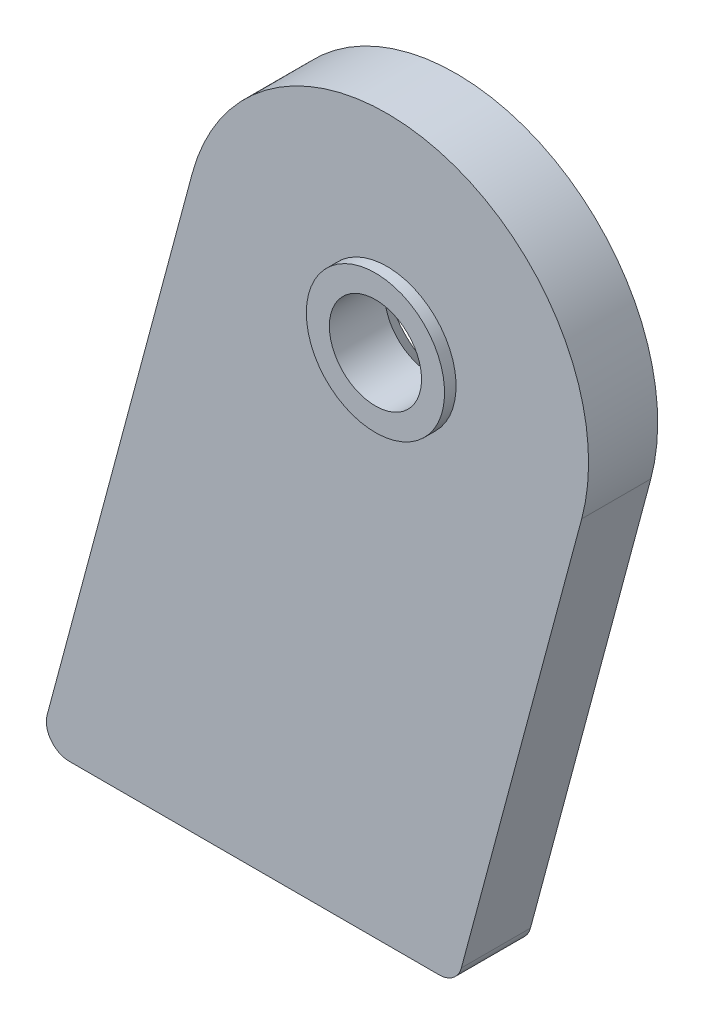
ISO-10303-21;
HEADER;
FILE_DESCRIPTION(('STEP AP214'),'2;1');
FILE_NAME('part.step','',(''),(''),'','','');
FILE_SCHEMA(('AUTOMOTIVE_DESIGN { 1 0 10303 214 1 1 1 1 }'));
ENDSEC;
DATA;
#1=APPLICATION_CONTEXT('core data for automotive mechanical design processes');
#2=APPLICATION_PROTOCOL_DEFINITION('international standard','automotive_design',2000,#1);
#3=PRODUCT_CONTEXT('',#1,'mechanical');
#4=PRODUCT('Part','Part','',(#3));
#5=PRODUCT_RELATED_PRODUCT_CATEGORY('part','',(#4));
#6=PRODUCT_DEFINITION_FORMATION('','',#4);
#7=PRODUCT_DEFINITION_CONTEXT('part definition',#1,'design');
#8=PRODUCT_DEFINITION('design','',#6,#7);
#9=PRODUCT_DEFINITION_SHAPE('','',#8);
#10=(LENGTH_UNIT() NAMED_UNIT(*) SI_UNIT(.MILLI.,.METRE.));
#11=(NAMED_UNIT(*) PLANE_ANGLE_UNIT() SI_UNIT($,.RADIAN.));
#12=(NAMED_UNIT(*) SI_UNIT($,.STERADIAN.) SOLID_ANGLE_UNIT());
#13=UNCERTAINTY_MEASURE_WITH_UNIT(LENGTH_MEASURE(1.E-05),#10,'distance_accuracy_value','');
#14=(GEOMETRIC_REPRESENTATION_CONTEXT(3) GLOBAL_UNCERTAINTY_ASSIGNED_CONTEXT((#13)) GLOBAL_UNIT_ASSIGNED_CONTEXT((#10,
#11,#12)) REPRESENTATION_CONTEXT('',''));
#15=CARTESIAN_POINT('',(0.,0.,0.));
#16=DIRECTION('',(0.,0.,1.));
#17=DIRECTION('',(1.,0.,0.));
#18=AXIS2_PLACEMENT_3D('',#15,#16,#17);
#19=CARTESIAN_POINT('',(52.,0.,-28.));
#20=DIRECTION('',(0.,0.,1.));
#21=DIRECTION('',(-1.,0.,0.));
#22=AXIS2_PLACEMENT_3D('',#19,#20,#21);
#23=CYLINDRICAL_SURFACE('',#22,17.5);
#24=CARTESIAN_POINT('',(52.,0.,-28.));
#25=DIRECTION('',(0.,0.,-1.));
#26=DIRECTION('',(-1.,0.,0.));
#27=AXIS2_PLACEMENT_3D('',#24,#25,#26);
#28=CIRCLE('',#27,17.5);
#29=CARTESIAN_POINT('',(35.0962980399413,4.529333289294,-28.));
#30=VERTEX_POINT('',#29);
#31=CARTESIAN_POINT('',(68.9037019600588,-4.529333289294,-28.));
#32=VERTEX_POINT('',#31);
#33=EDGE_CURVE('E122',#30,#32,#28,.T.);
#34=ORIENTED_EDGE('',*,*,#33,.T.);
#35=DIRECTION('',(0.,0.,-1.));
#36=VECTOR('',#35,1.);
#37=CARTESIAN_POINT('',(68.9037019600587,-4.529333289294,-28.));
#38=LINE('',#37,#36);
#39=CARTESIAN_POINT('',(68.9037019600587,-4.529333289294,-34.));
#40=VERTEX_POINT('',#39);
#41=EDGE_CURVE('E119',#32,#40,#38,.T.);
#42=ORIENTED_EDGE('',*,*,#41,.T.);
#43=CARTESIAN_POINT('',(52.,0.,-34.));
#44=DIRECTION('',(0.,0.,-1.));
#45=DIRECTION('',(-1.,0.,0.));
#46=AXIS2_PLACEMENT_3D('',#43,#44,#45);
#47=CIRCLE('',#46,17.5);
#48=CARTESIAN_POINT('',(35.0962980399413,4.529333289294,-34.));
#49=VERTEX_POINT('',#48);
#50=EDGE_CURVE('E103',#49,#40,#47,.T.);
#51=ORIENTED_EDGE('',*,*,#50,.F.);
#52=DIRECTION('',(0.,0.,-1.));
#53=VECTOR('',#52,1.);
#54=CARTESIAN_POINT('',(35.0962980399413,4.529333289294,-28.));
#55=LINE('',#54,#53);
#56=EDGE_CURVE('E112',#30,#49,#55,.T.);
#57=ORIENTED_EDGE('',*,*,#56,.F.);
#58=EDGE_LOOP('',(#34,#42,#51,#57));
#59=FACE_BOUND('',#58,.T.);
#60=ADVANCED_FACE('F45',(#59),#23,.T.);
#61=CARTESIAN_POINT('',(48.,0.,-27.));
#62=DIRECTION('',(0.,0.,1.));
#63=DIRECTION('',(-1.,0.,0.));
#64=AXIS2_PLACEMENT_3D('',#61,#62,#63);
#65=PLANE('',#64);
#66=CARTESIAN_POINT('',(52.,0.,-27.));
#67=DIRECTION('',(0.,0.,-1.));
#68=DIRECTION('',(-1.,0.,0.));
#69=AXIS2_PLACEMENT_3D('',#66,#67,#68);
#70=CIRCLE('',#69,6.00000000000001);
#71=CARTESIAN_POINT('',(46.,0.,-27.));
#72=VERTEX_POINT('',#71);
#73=EDGE_CURVE('E130',#72,#72,#70,.T.);
#74=ORIENTED_EDGE('',*,*,#73,.F.);
#75=EDGE_LOOP('',(#74));
#76=FACE_BOUND('',#75,.T.);
#77=CARTESIAN_POINT('',(52.,0.,-27.));
#78=DIRECTION('',(0.,0.,-1.));
#79=DIRECTION('',(-1.,0.,0.));
#80=AXIS2_PLACEMENT_3D('',#77,#78,#79);
#81=CIRCLE('',#80,4.00000000000001);
#82=CARTESIAN_POINT('',(48.,0.,-27.));
#83=VERTEX_POINT('',#82);
#84=EDGE_CURVE('E133',#83,#83,#81,.T.);
#85=ORIENTED_EDGE('',*,*,#84,.T.);
#86=EDGE_LOOP('',(#85));
#87=FACE_BOUND('',#86,.T.);
#88=ADVANCED_FACE('F179',(#76,#87),#65,.T.);
#89=CARTESIAN_POINT('',(52.,0.,-28.));
#90=DIRECTION('',(0.,0.,1.));
#91=DIRECTION('',(-1.,0.,0.));
#92=AXIS2_PLACEMENT_3D('',#89,#90,#91);
#93=CYLINDRICAL_SURFACE('',#92,6.00000000000001);
#94=CARTESIAN_POINT('',(52.,0.,-28.));
#95=DIRECTION('',(0.,0.,-1.));
#96=DIRECTION('',(-1.,0.,0.));
#97=AXIS2_PLACEMENT_3D('',#94,#95,#96);
#98=CIRCLE('',#97,6.00000000000001);
#99=CARTESIAN_POINT('',(46.,0.,-28.));
#100=VERTEX_POINT('',#99);
#101=EDGE_CURVE('E124',#100,#100,#98,.T.);
#102=ORIENTED_EDGE('',*,*,#101,.F.);
#103=EDGE_LOOP('',(#102));
#104=FACE_BOUND('',#103,.T.);
#105=ORIENTED_EDGE('',*,*,#73,.T.);
#106=EDGE_LOOP('',(#105));
#107=FACE_BOUND('',#106,.T.);
#108=ADVANCED_FACE('F184',(#104,#107),#93,.T.);
#109=CARTESIAN_POINT('',(46.,0.,-28.));
#110=DIRECTION('',(0.,0.,1.));
#111=DIRECTION('',(-1.,0.,0.));
#112=AXIS2_PLACEMENT_3D('',#109,#110,#111);
#113=PLANE('',#112);
#114=DIRECTION('',(0.258819045102514,0.96592582628907,0.));
#115=VECTOR('',#114,1.);
#116=CARTESIAN_POINT('',(58.0596194977762,-45.,-28.));
#117=LINE('',#116,#115);
#118=CARTESIAN_POINT('',(58.4568171743964,-43.517638090205,-28.));
#119=VERTEX_POINT('',#118);
#120=EDGE_CURVE('E156',#119,#32,#117,.T.);
#121=ORIENTED_EDGE('',*,*,#120,.T.);
#122=ORIENTED_EDGE('',*,*,#33,.F.);
#123=DIRECTION('',(-0.258819045102514,-0.96592582628907,0.));
#124=VECTOR('',#123,1.);
#125=CARTESIAN_POINT('',(35.0962980399413,4.529333289294,-28.));
#126=LINE('',#125,#124);
#127=CARTESIAN_POINT('',(22.4995522765276,-42.482361909795,-28.));
#128=VERTEX_POINT('',#127);
#129=EDGE_CURVE('E115',#30,#128,#126,.T.);
#130=ORIENTED_EDGE('',*,*,#129,.T.);
#131=CARTESIAN_POINT('',(24.4314039291058,-43.,-28.));
#132=DIRECTION('',(0.,0.,-1.));
#133=DIRECTION('',(-1.,0.,0.));
#134=AXIS2_PLACEMENT_3D('',#131,#132,#133);
#135=CIRCLE('',#134,2.);
#136=CARTESIAN_POINT('',(24.4314039291058,-45.,-28.));
#137=VERTEX_POINT('',#136);
#138=EDGE_CURVE('E144',#137,#128,#135,.T.);
#139=ORIENTED_EDGE('',*,*,#138,.F.);
#140=DIRECTION('',(1.,0.,0.));
#141=VECTOR('',#140,1.);
#142=CARTESIAN_POINT('',(21.8249531834234,-45.,-28.));
#143=LINE('',#142,#141);
#144=CARTESIAN_POINT('',(56.5249655218183,-45.,-28.));
#145=VERTEX_POINT('',#144);
#146=EDGE_CURVE('E152',#137,#145,#143,.T.);
#147=ORIENTED_EDGE('',*,*,#146,.T.);
#148=CARTESIAN_POINT('',(56.5249655218183,-43.,-28.));
#149=DIRECTION('',(0.,0.,-1.));
#150=DIRECTION('',(-1.,0.,0.));
#151=AXIS2_PLACEMENT_3D('',#148,#149,#150);
#152=CIRCLE('',#151,2.);
#153=EDGE_CURVE('E53',#119,#145,#152,.T.);
#154=ORIENTED_EDGE('',*,*,#153,.F.);
#155=EDGE_LOOP('',(#121,#122,#130,#139,#147,#154));
#156=FACE_BOUND('',#155,.T.);
#157=ORIENTED_EDGE('',*,*,#101,.T.);
#158=EDGE_LOOP('',(#157));
#159=FACE_BOUND('',#158,.T.);
#160=ADVANCED_FACE('F153',(#156,#159),#113,.T.);
#161=CARTESIAN_POINT('',(34.5,0.,-34.));
#162=DIRECTION('',(0.,0.,-1.));
#163=DIRECTION('',(1.,0.,0.));
#164=AXIS2_PLACEMENT_3D('',#161,#162,#163);
#165=PLANE('',#164);
#166=CARTESIAN_POINT('',(52.,0.,-34.));
#167=DIRECTION('',(0.,0.,1.));
#168=DIRECTION('',(1.,0.,0.));
#169=AXIS2_PLACEMENT_3D('',#166,#167,#168);
#170=CIRCLE('',#169,6.2);
#171=CARTESIAN_POINT('',(58.2,0.,-34.));
#172=VERTEX_POINT('',#171);
#173=EDGE_CURVE('E292',#172,#172,#170,.T.);
#174=ORIENTED_EDGE('',*,*,#173,.T.);
#175=EDGE_LOOP('',(#174));
#176=FACE_BOUND('',#175,.T.);
#177=DIRECTION('',(1.,0.,0.));
#178=VECTOR('',#177,1.);
#179=CARTESIAN_POINT('',(21.8249531834234,-45.,-34.));
#180=LINE('',#179,#178);
#181=CARTESIAN_POINT('',(24.4314039291058,-45.,-34.));
#182=VERTEX_POINT('',#181);
#183=CARTESIAN_POINT('',(56.5249655218183,-45.,-34.));
#184=VERTEX_POINT('',#183);
#185=EDGE_CURVE('E108',#182,#184,#180,.T.);
#186=ORIENTED_EDGE('',*,*,#185,.F.);
#187=CARTESIAN_POINT('',(24.4314039291058,-43.,-34.));
#188=DIRECTION('',(0.,0.,1.));
#189=DIRECTION('',(1.,0.,0.));
#190=AXIS2_PLACEMENT_3D('',#187,#188,#189);
#191=CIRCLE('',#190,2.);
#192=CARTESIAN_POINT('',(22.4995522765276,-42.482361909795,-34.));
#193=VERTEX_POINT('',#192);
#194=EDGE_CURVE('E106',#193,#182,#191,.T.);
#195=ORIENTED_EDGE('',*,*,#194,.F.);
#196=DIRECTION('',(-0.258819045102514,-0.96592582628907,0.));
#197=VECTOR('',#196,1.);
#198=CARTESIAN_POINT('',(35.0962980399413,4.529333289294,-34.));
#199=LINE('',#198,#197);
#200=EDGE_CURVE('E97',#49,#193,#199,.T.);
#201=ORIENTED_EDGE('',*,*,#200,.F.);
#202=ORIENTED_EDGE('',*,*,#50,.T.);
#203=DIRECTION('',(0.258819045102514,0.96592582628907,0.));
#204=VECTOR('',#203,1.);
#205=CARTESIAN_POINT('',(58.0596194977762,-45.,-34.));
#206=LINE('',#205,#204);
#207=CARTESIAN_POINT('',(58.4568171743964,-43.517638090205,-34.));
#208=VERTEX_POINT('',#207);
#209=EDGE_CURVE('E160',#208,#40,#206,.T.);
#210=ORIENTED_EDGE('',*,*,#209,.F.);
#211=CARTESIAN_POINT('',(56.5249655218183,-43.,-34.));
#212=DIRECTION('',(0.,0.,1.));
#213=DIRECTION('',(1.,0.,0.));
#214=AXIS2_PLACEMENT_3D('',#211,#212,#213);
#215=CIRCLE('',#214,2.);
#216=EDGE_CURVE('E141',#184,#208,#215,.T.);
#217=ORIENTED_EDGE('',*,*,#216,.F.);
#218=EDGE_LOOP('',(#186,#195,#201,#202,#210,#217));
#219=FACE_BOUND('',#218,.T.);
#220=ADVANCED_FACE('F100',(#176,#219),#165,.T.);
#221=CARTESIAN_POINT('',(52.,0.,-28.));
#222=DIRECTION('',(0.,0.,1.));
#223=DIRECTION('',(-1.,0.,0.));
#224=AXIS2_PLACEMENT_3D('',#221,#222,#223);
#225=CYLINDRICAL_SURFACE('',#224,4.00000000000001);
#226=CARTESIAN_POINT('',(52.,0.,-31.8));
#227=DIRECTION('',(0.,0.,1.));
#228=DIRECTION('',(1.,0.,0.));
#229=AXIS2_PLACEMENT_3D('',#226,#227,#228);
#230=CIRCLE('',#229,4.00000000000001);
#231=CARTESIAN_POINT('',(56.,0.,-31.8));
#232=VERTEX_POINT('',#231);
#233=EDGE_CURVE('E109',#232,#232,#230,.F.);
#234=ORIENTED_EDGE('',*,*,#233,.T.);
#235=EDGE_LOOP('',(#234));
#236=FACE_BOUND('',#235,.T.);
#237=ORIENTED_EDGE('',*,*,#84,.F.);
#238=EDGE_LOOP('',(#237));
#239=FACE_BOUND('',#238,.T.);
#240=ADVANCED_FACE('F203',(#236,#239),#225,.F.);
#241=CARTESIAN_POINT('',(35.0962980399413,4.529333289294,-28.));
#242=DIRECTION('',(-0.96592582628907,0.258819045102514,0.));
#243=DIRECTION('',(-0.258819045102514,-0.96592582628907,0.));
#244=AXIS2_PLACEMENT_3D('',#241,#242,#243);
#245=PLANE('',#244);
#246=ORIENTED_EDGE('',*,*,#129,.F.);
#247=ORIENTED_EDGE('',*,*,#56,.T.);
#248=ORIENTED_EDGE('',*,*,#200,.T.);
#249=DIRECTION('',(0.,0.,-1.));
#250=VECTOR('',#249,1.);
#251=CARTESIAN_POINT('',(22.4995522765276,-42.482361909795,-28.));
#252=LINE('',#251,#250);
#253=EDGE_CURVE('E11',#128,#193,#252,.T.);
#254=ORIENTED_EDGE('',*,*,#253,.F.);
#255=EDGE_LOOP('',(#246,#247,#248,#254));
#256=FACE_BOUND('',#255,.T.);
#257=ADVANCED_FACE('F113',(#256),#245,.T.);
#258=CARTESIAN_POINT('',(58.0596194977762,-45.,-28.));
#259=DIRECTION('',(0.96592582628907,-0.258819045102514,0.));
#260=DIRECTION('',(0.258819045102514,0.96592582628907,0.));
#261=AXIS2_PLACEMENT_3D('',#258,#259,#260);
#262=PLANE('',#261);
#263=ORIENTED_EDGE('',*,*,#209,.T.);
#264=ORIENTED_EDGE('',*,*,#41,.F.);
#265=ORIENTED_EDGE('',*,*,#120,.F.);
#266=DIRECTION('',(0.,0.,-1.));
#267=VECTOR('',#266,1.);
#268=CARTESIAN_POINT('',(58.4568171743964,-43.517638090205,-28.));
#269=LINE('',#268,#267);
#270=EDGE_CURVE('E66',#208,#119,#269,.F.);
#271=ORIENTED_EDGE('',*,*,#270,.F.);
#272=EDGE_LOOP('',(#263,#264,#265,#271));
#273=FACE_BOUND('',#272,.T.);
#274=ADVANCED_FACE('F167',(#273),#262,.T.);
#275=CARTESIAN_POINT('',(21.8249531834234,-45.,-28.));
#276=DIRECTION('',(0.,-1.,0.));
#277=DIRECTION('',(0.,0.,1.));
#278=AXIS2_PLACEMENT_3D('',#275,#276,#277);
#279=PLANE('',#278);
#280=ORIENTED_EDGE('',*,*,#146,.F.);
#281=DIRECTION('',(0.,0.,-1.));
#282=VECTOR('',#281,1.);
#283=CARTESIAN_POINT('',(24.4314039291058,-45.,-28.));
#284=LINE('',#283,#282);
#285=EDGE_CURVE('E136',#182,#137,#284,.F.);
#286=ORIENTED_EDGE('',*,*,#285,.F.);
#287=ORIENTED_EDGE('',*,*,#185,.T.);
#288=DIRECTION('',(0.,0.,-1.));
#289=VECTOR('',#288,1.);
#290=CARTESIAN_POINT('',(56.5249655218183,-45.,-28.));
#291=LINE('',#290,#289);
#292=EDGE_CURVE('E138',#145,#184,#291,.T.);
#293=ORIENTED_EDGE('',*,*,#292,.F.);
#294=EDGE_LOOP('',(#280,#286,#287,#293));
#295=FACE_BOUND('',#294,.T.);
#296=ADVANCED_FACE('F168',(#295),#279,.T.);
#297=CARTESIAN_POINT('',(56.5249655218183,-43.,-28.));
#298=DIRECTION('',(0.,0.,-1.));
#299=DIRECTION('',(1.,0.,0.));
#300=AXIS2_PLACEMENT_3D('',#297,#298,#299);
#301=CYLINDRICAL_SURFACE('',#300,2.);
#302=ORIENTED_EDGE('',*,*,#153,.T.);
#303=ORIENTED_EDGE('',*,*,#292,.T.);
#304=ORIENTED_EDGE('',*,*,#216,.T.);
#305=ORIENTED_EDGE('',*,*,#270,.T.);
#306=EDGE_LOOP('',(#302,#303,#304,#305));
#307=FACE_BOUND('',#306,.T.);
#308=ADVANCED_FACE('F146',(#307),#301,.T.);
#309=CARTESIAN_POINT('',(24.4314039291058,-43.,-28.));
#310=DIRECTION('',(0.,0.,-1.));
#311=DIRECTION('',(1.,0.,0.));
#312=AXIS2_PLACEMENT_3D('',#309,#310,#311);
#313=CYLINDRICAL_SURFACE('',#312,2.);
#314=ORIENTED_EDGE('',*,*,#138,.T.);
#315=ORIENTED_EDGE('',*,*,#253,.T.);
#316=ORIENTED_EDGE('',*,*,#194,.T.);
#317=ORIENTED_EDGE('',*,*,#285,.T.);
#318=EDGE_LOOP('',(#314,#315,#316,#317));
#319=FACE_BOUND('',#318,.T.);
#320=ADVANCED_FACE('F47',(#319),#313,.T.);
#321=CARTESIAN_POINT('',(52.,0.,-34.));
#322=DIRECTION('',(0.,0.,-1.));
#323=DIRECTION('',(1.,0.,0.));
#324=AXIS2_PLACEMENT_3D('',#321,#322,#323);
#325=CONICAL_SURFACE('',#324,6.2,0.785398163397448);
#326=ORIENTED_EDGE('',*,*,#233,.F.);
#327=EDGE_LOOP('',(#326));
#328=FACE_BOUND('',#327,.T.);
#329=ORIENTED_EDGE('',*,*,#173,.F.);
#330=EDGE_LOOP('',(#329));
#331=FACE_BOUND('',#330,.T.);
#332=ADVANCED_FACE('F171',(#328,#331),#325,.F.);
#333=CLOSED_SHELL('',(#60,#88,#108,#160,#220,#240,#257,#274,#296,#308,#320,#332));
#334=MANIFOLD_SOLID_BREP('B2',#333);
#335=ADVANCED_BREP_SHAPE_REPRESENTATION('',(#18,#334),#14);
#336=SHAPE_DEFINITION_REPRESENTATION(#9,#335);
ENDSEC;
END-ISO-10303-21;
